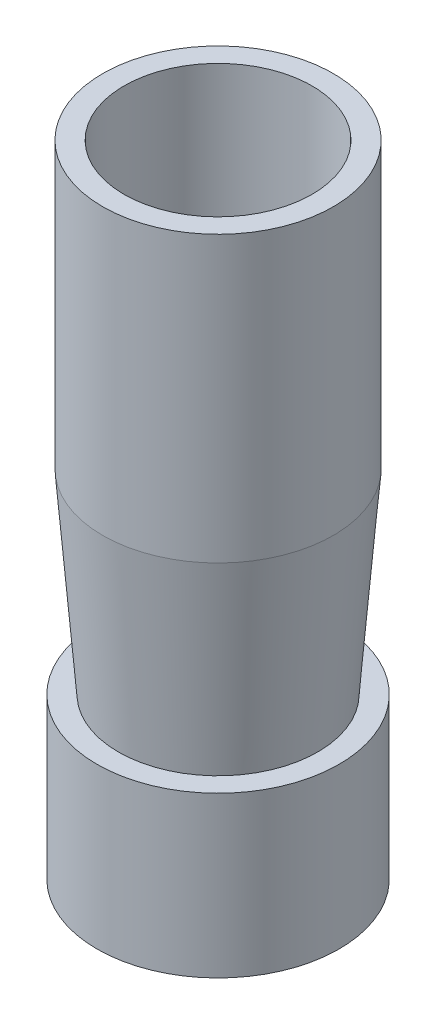
ISO-10303-21;
HEADER;
FILE_DESCRIPTION(('STEP AP214'),'2;1');
FILE_NAME('part.step','',(''),(''),'','','');
FILE_SCHEMA(('AUTOMOTIVE_DESIGN { 1 0 10303 214 1 1 1 1 }'));
ENDSEC;
DATA;
#1=APPLICATION_CONTEXT('core data for automotive mechanical design processes');
#2=APPLICATION_PROTOCOL_DEFINITION('international standard','automotive_design',2000,#1);
#3=PRODUCT_CONTEXT('',#1,'mechanical');
#4=PRODUCT('Part','Part','',(#3));
#5=PRODUCT_RELATED_PRODUCT_CATEGORY('part','',(#4));
#6=PRODUCT_DEFINITION_FORMATION('','',#4);
#7=PRODUCT_DEFINITION_CONTEXT('part definition',#1,'design');
#8=PRODUCT_DEFINITION('design','',#6,#7);
#9=PRODUCT_DEFINITION_SHAPE('','',#8);
#10=(LENGTH_UNIT() NAMED_UNIT(*) SI_UNIT(.MILLI.,.METRE.));
#11=(NAMED_UNIT(*) PLANE_ANGLE_UNIT() SI_UNIT($,.RADIAN.));
#12=(NAMED_UNIT(*) SI_UNIT($,.STERADIAN.) SOLID_ANGLE_UNIT());
#13=UNCERTAINTY_MEASURE_WITH_UNIT(LENGTH_MEASURE(1.E-05),#10,'distance_accuracy_value','');
#14=(GEOMETRIC_REPRESENTATION_CONTEXT(3) GLOBAL_UNCERTAINTY_ASSIGNED_CONTEXT((#13)) GLOBAL_UNIT_ASSIGNED_CONTEXT((#10,
#11,#12)) REPRESENTATION_CONTEXT('',''));
#15=CARTESIAN_POINT('',(0.,0.,0.));
#16=DIRECTION('',(0.,0.,1.));
#17=DIRECTION('',(1.,0.,0.));
#18=AXIS2_PLACEMENT_3D('',#15,#16,#17);
#19=CARTESIAN_POINT('',(-25.6120969503537,43.0163177549968,0.));
#20=DIRECTION('',(0.,1.,0.));
#21=DIRECTION('',(0.,0.,1.));
#22=AXIS2_PLACEMENT_3D('',#19,#20,#21);
#23=PLANE('',#22);
#24=CARTESIAN_POINT('',(-14.7970969503537,43.0163177549968,0.));
#25=DIRECTION('',(0.,1.,0.));
#26=DIRECTION('',(0.,0.,1.));
#27=AXIS2_PLACEMENT_3D('',#24,#25,#26);
#28=CIRCLE('',#27,10.815);
#29=CARTESIAN_POINT('',(-14.7970969503537,43.0163177549968,10.815));
#30=VERTEX_POINT('',#29);
#31=EDGE_CURVE('E10',#30,#30,#28,.T.);
#32=ORIENTED_EDGE('',*,*,#31,.T.);
#33=EDGE_LOOP('',(#32));
#34=FACE_BOUND('',#33,.T.);
#35=CARTESIAN_POINT('',(-14.7970969503537,43.0163177549968,0.));
#36=DIRECTION('',(0.,1.,0.));
#37=DIRECTION('',(0.,0.,1.));
#38=AXIS2_PLACEMENT_3D('',#35,#36,#37);
#39=CIRCLE('',#38,8.81499999999994);
#40=CARTESIAN_POINT('',(-14.7970969503537,43.0163177549968,8.81499999999994));
#41=VERTEX_POINT('',#40);
#42=EDGE_CURVE('E50',#41,#41,#39,.T.);
#43=ORIENTED_EDGE('',*,*,#42,.F.);
#44=EDGE_LOOP('',(#43));
#45=FACE_BOUND('',#44,.T.);
#46=ADVANCED_FACE('F43',(#34,#45),#23,.T.);
#47=CARTESIAN_POINT('',(-14.7970969503537,26.4248387096774,0.));
#48=DIRECTION('',(0.,1.,0.));
#49=DIRECTION('',(0.,0.,1.));
#50=AXIS2_PLACEMENT_3D('',#47,#48,#49);
#51=CYLINDRICAL_SURFACE('',#50,8.81499999999997);
#52=ORIENTED_EDGE('',*,*,#42,.T.);
#53=EDGE_LOOP('',(#52));
#54=FACE_BOUND('',#53,.T.);
#55=CARTESIAN_POINT('',(-14.7970969503537,26.3263177549968,0.));
#56=DIRECTION('',(0.,1.,0.));
#57=DIRECTION('',(0.,0.,1.));
#58=AXIS2_PLACEMENT_3D('',#55,#56,#57);
#59=CIRCLE('',#58,8.815);
#60=CARTESIAN_POINT('',(-14.7970969503537,26.3263177549968,8.815));
#61=VERTEX_POINT('',#60);
#62=EDGE_CURVE('E55',#61,#61,#59,.T.);
#63=ORIENTED_EDGE('',*,*,#62,.F.);
#64=EDGE_LOOP('',(#63));
#65=FACE_BOUND('',#64,.T.);
#66=ADVANCED_FACE('F120',(#54,#65),#51,.F.);
#67=CARTESIAN_POINT('',(-14.7970969503537,-12.3512431395056,0.));
#68=DIRECTION('',(0.,1.,0.));
#69=DIRECTION('',(0.,0.,1.));
#70=AXIS2_PLACEMENT_3D('',#67,#68,#69);
#71=CONICAL_SURFACE('',#70,2.74999999999999,0.155542634404642);
#72=CARTESIAN_POINT('',(-14.7970969503537,-12.3512431395056,0.));
#73=DIRECTION('',(0.,1.,0.));
#74=DIRECTION('',(0.,0.,1.));
#75=AXIS2_PLACEMENT_3D('',#72,#73,#74);
#76=CIRCLE('',#75,2.74999999999999);
#77=CARTESIAN_POINT('',(-14.7970969503537,-12.3512431395056,2.74999999999999));
#78=VERTEX_POINT('',#77);
#79=EDGE_CURVE('E60',#78,#78,#76,.T.);
#80=CARTESIAN_POINT('',(-14.7970969503537,26.3263177549968,8.815));
#81=CARTESIAN_POINT('',(-14.7970969503537,25.923426495679,8.75182291666667));
#82=CARTESIAN_POINT('',(-14.7970969503537,25.5205352363613,8.68864583333333));
#83=CARTESIAN_POINT('',(-14.7970969503537,24.7147527177258,8.56229166666667));
#84=CARTESIAN_POINT('',(-14.7970969503537,24.3118614584081,8.49911458333333));
#85=CARTESIAN_POINT('',(-14.7970969503537,23.5060789397726,8.37276041666667));
#86=CARTESIAN_POINT('',(-14.7970969503537,23.1031876804549,8.30958333333333));
#87=CARTESIAN_POINT('',(-14.7970969503537,22.2974051618194,8.18322916666667));
#88=CARTESIAN_POINT('',(-14.7970969503537,21.8945139025017,8.12005208333333));
#89=CARTESIAN_POINT('',(-14.7970969503537,21.0887313838662,7.99369791666666));
#90=CARTESIAN_POINT('',(-14.7970969503537,20.6858401245485,7.93052083333333));
#91=CARTESIAN_POINT('',(-14.7970969503537,19.880057605913,7.80416666666666));
#92=CARTESIAN_POINT('',(-14.7970969503537,19.4771663465953,7.74098958333333));
#93=CARTESIAN_POINT('',(-14.7970969503537,18.6713838279598,7.61463541666666));
#94=CARTESIAN_POINT('',(-14.7970969503537,18.2684925686421,7.55145833333333));
#95=CARTESIAN_POINT('',(-14.7970969503537,17.4627100500066,7.42510416666666));
#96=CARTESIAN_POINT('',(-14.7970969503537,17.0598187906889,7.36192708333333));
#97=CARTESIAN_POINT('',(-14.7970969503537,16.2540362720534,7.23557291666666));
#98=CARTESIAN_POINT('',(-14.7970969503537,15.8511450127357,7.17239583333333));
#99=CARTESIAN_POINT('',(-14.7970969503537,15.0453624941002,7.04604166666666));
#100=CARTESIAN_POINT('',(-14.7970969503537,14.6424712347825,6.98286458333333));
#101=CARTESIAN_POINT('',(-14.7970969503537,13.836688716147,6.85651041666666));
#102=CARTESIAN_POINT('',(-14.7970969503537,13.4337974568293,6.79333333333333));
#103=CARTESIAN_POINT('',(-14.7970969503537,12.6280149381938,6.66697916666666));
#104=CARTESIAN_POINT('',(-14.7970969503537,12.2251236788761,6.60380208333333));
#105=CARTESIAN_POINT('',(-14.7970969503537,11.4193411602406,6.47744791666666));
#106=CARTESIAN_POINT('',(-14.7970969503537,11.0164499009229,6.41427083333333));
#107=CARTESIAN_POINT('',(-14.7970969503537,10.2106673822874,6.28791666666666));
#108=CARTESIAN_POINT('',(-14.7970969503537,9.8077761229697,6.22473958333333));
#109=CARTESIAN_POINT('',(-14.7970969503537,9.00199360433423,6.09838541666666));
#110=CARTESIAN_POINT('',(-14.7970969503537,8.5991023450165,6.03520833333333));
#111=CARTESIAN_POINT('',(-14.7970969503537,7.79331982638104,5.90885416666666));
#112=CARTESIAN_POINT('',(-14.7970969503537,7.3904285670633,5.84567708333333));
#113=CARTESIAN_POINT('',(-14.7970969503537,6.58464604842783,5.71932291666666));
#114=CARTESIAN_POINT('',(-14.7970969503537,6.1817547891101,5.65614583333333));
#115=CARTESIAN_POINT('',(-14.7970969503537,5.37597227047463,5.52979166666666));
#116=CARTESIAN_POINT('',(-14.7970969503537,4.9730810111569,5.46661458333333));
#117=CARTESIAN_POINT('',(-14.7970969503537,4.16729849252143,5.34026041666666));
#118=CARTESIAN_POINT('',(-14.7970969503537,3.7644072332037,5.27708333333333));
#119=CARTESIAN_POINT('',(-14.7970969503537,2.95862471456823,5.15072916666666));
#120=CARTESIAN_POINT('',(-14.7970969503537,2.5557334552505,5.08755208333333));
#121=CARTESIAN_POINT('',(-14.7970969503537,1.74995093661503,4.96119791666666));
#122=CARTESIAN_POINT('',(-14.7970969503537,1.3470596772973,4.89802083333333));
#123=CARTESIAN_POINT('',(-14.7970969503537,0.54127715866183,4.77166666666666));
#124=CARTESIAN_POINT('',(-14.7970969503537,0.138385899344097,4.70848958333333));
#125=CARTESIAN_POINT('',(-14.7970969503537,-0.667396619291369,4.58213541666666));
#126=CARTESIAN_POINT('',(-14.7970969503537,-1.0702878786091,4.51895833333333));
#127=CARTESIAN_POINT('',(-14.7970969503537,-1.87607039724457,4.39260416666666));
#128=CARTESIAN_POINT('',(-14.7970969503537,-2.2789616565623,4.32942708333333));
#129=CARTESIAN_POINT('',(-14.7970969503537,-3.08474417519777,4.20307291666666));
#130=CARTESIAN_POINT('',(-14.7970969503537,-3.4876354345155,4.13989583333333));
#131=CARTESIAN_POINT('',(-14.7970969503537,-4.29341795315097,4.01354166666666));
#132=CARTESIAN_POINT('',(-14.7970969503537,-4.69630921246871,3.95036458333332));
#133=CARTESIAN_POINT('',(-14.7970969503537,-5.50209173110417,3.82401041666666));
#134=CARTESIAN_POINT('',(-14.7970969503537,-5.9049829904219,3.76083333333332));
#135=CARTESIAN_POINT('',(-14.7970969503537,-6.71076550905737,3.63447916666666));
#136=CARTESIAN_POINT('',(-14.7970969503537,-7.11365676837511,3.57130208333332));
#137=CARTESIAN_POINT('',(-14.7970969503537,-7.91943928701057,3.44494791666666));
#138=CARTESIAN_POINT('',(-14.7970969503537,-8.32233054632831,3.38177083333332));
#139=CARTESIAN_POINT('',(-14.7970969503537,-9.12811306496377,3.25541666666666));
#140=CARTESIAN_POINT('',(-14.7970969503537,-9.53100432428151,3.19223958333332));
#141=CARTESIAN_POINT('',(-14.7970969503537,-10.336786842917,3.06588541666666));
#142=CARTESIAN_POINT('',(-14.7970969503537,-10.7396781022347,3.00270833333332));
#143=CARTESIAN_POINT('',(-14.7970969503537,-11.5454606208702,2.87635416666666));
#144=CARTESIAN_POINT('',(-14.7970969503537,-11.9483518801879,2.81317708333332));
#145=CARTESIAN_POINT('',(-14.7970969503537,-12.3512431395056,2.74999999999999));
#146=B_SPLINE_CURVE_WITH_KNOTS('',3,(#80,#81,#82,#83,#84,#85,#86,#87,#88,#89,#90,#91,#92,#93,
#94,#95,#96,#97,#98,#99,#100,#101,#102,#103,#104,#105,#106,#107,#108,#109,#110,#111,#112,#113,
#114,#115,#116,#117,#118,#119,#120,#121,#122,#123,#124,#125,#126,#127,#128,#129,#130,#131,#132,
#133,#134,#135,#136,#137,#138,#139,#140,#141,#142,#143,#144,#145),.UNSPECIFIED.,.F.,.F.,(4,2,2,
2,2,2,2,2,2,2,2,2,2,2,2,2,2,2,2,2,2,2,2,2,2,2,2,2,2,2,2,2,4),(0.,1.22344366287877,
2.44688732575755,3.67033098863631,4.89377465151509,6.11721831439386,7.34066197727262,
8.5641056401514,9.78754930303017,11.0109929659089,12.2344366287877,13.4578802916665,
14.6813239545453,15.904767617424,17.1282112803028,18.3516549431816,19.5750986060603,
20.7985422689391,22.0219859318179,23.2454295946967,24.4688732575754,25.6923169204542,
26.915760583333,28.1392042462118,29.3626479090905,30.5860915719693,31.8095352348481,
33.0329788977268,34.2564225606056,35.4798662234844,36.7033098863631,37.9267535492419,
39.1501972121207),.UNSPECIFIED.);
#147=EDGE_CURVE('BSEAM124',#61,#78,#146,.T.);
#148=ORIENTED_EDGE('',*,*,#62,.T.);
#149=ORIENTED_EDGE('',*,*,#79,.F.);
#150=ORIENTED_EDGE('',*,*,#147,.T.);
#151=ORIENTED_EDGE('',*,*,#147,.F.);
#152=EDGE_LOOP('',(#148,#150,#149,#151));
#153=FACE_BOUND('',#152,.T.);
#154=ADVANCED_FACE('F124',(#153),#71,.F.);
#155=CARTESIAN_POINT('',(-14.7970969503537,-12.5520427359334,0.));
#156=DIRECTION('',(0.,-1.,0.));
#157=DIRECTION('',(0.,0.,-1.));
#158=AXIS2_PLACEMENT_3D('',#155,#156,#157);
#159=CONICAL_SURFACE('',#158,2.99999999999999,0.894108189836582);
#160=ORIENTED_EDGE('',*,*,#79,.T.);
#161=EDGE_LOOP('',(#160));
#162=FACE_BOUND('',#161,.T.);
#163=CARTESIAN_POINT('',(-14.7970969503537,-12.5520427359334,0.));
#164=DIRECTION('',(0.,1.,0.));
#165=DIRECTION('',(0.,0.,1.));
#166=AXIS2_PLACEMENT_3D('',#163,#164,#165);
#167=CIRCLE('',#166,2.99999999999999);
#168=CARTESIAN_POINT('',(-14.7970969503537,-12.5520427359334,2.99999999999999));
#169=VERTEX_POINT('',#168);
#170=EDGE_CURVE('E66',#169,#169,#167,.T.);
#171=ORIENTED_EDGE('',*,*,#170,.F.);
#172=EDGE_LOOP('',(#171));
#173=FACE_BOUND('',#172,.T.);
#174=ADVANCED_FACE('F129',(#162,#173),#159,.F.);
#175=CARTESIAN_POINT('',(-14.7970969503537,23.1029597459589,0.));
#176=DIRECTION('',(0.,1.,0.));
#177=DIRECTION('',(0.,0.,1.));
#178=AXIS2_PLACEMENT_3D('',#175,#176,#177);
#179=CONICAL_SURFACE('',#178,8.815,0.161667372540477);
#180=ORIENTED_EDGE('',*,*,#170,.T.);
#181=EDGE_LOOP('',(#180));
#182=FACE_BOUND('',#181,.T.);
#183=CARTESIAN_POINT('',(-14.7970969503537,23.1029597459589,0.));
#184=DIRECTION('',(0.,1.,0.));
#185=DIRECTION('',(0.,0.,1.));
#186=AXIS2_PLACEMENT_3D('',#183,#184,#185);
#187=CIRCLE('',#186,8.815);
#188=CARTESIAN_POINT('',(-14.7970969503537,23.1029597459589,8.815));
#189=VERTEX_POINT('',#188);
#190=EDGE_CURVE('E70',#189,#189,#187,.T.);
#191=ORIENTED_EDGE('',*,*,#190,.F.);
#192=EDGE_LOOP('',(#191));
#193=FACE_BOUND('',#192,.T.);
#194=ADVANCED_FACE('F136',(#182,#193),#179,.T.);
#195=CARTESIAN_POINT('',(-14.7970969503537,26.4248387096774,0.));
#196=DIRECTION('',(0.,1.,0.));
#197=DIRECTION('',(0.,0.,1.));
#198=AXIS2_PLACEMENT_3D('',#195,#196,#197);
#199=CYLINDRICAL_SURFACE('',#198,8.815);
#200=ORIENTED_EDGE('',*,*,#190,.T.);
#201=EDGE_LOOP('',(#200));
#202=FACE_BOUND('',#201,.T.);
#203=CARTESIAN_POINT('',(-14.7970969503537,16.3263177549968,0.));
#204=DIRECTION('',(0.,1.,0.));
#205=DIRECTION('',(0.,0.,1.));
#206=AXIS2_PLACEMENT_3D('',#203,#204,#205);
#207=CIRCLE('',#206,8.815);
#208=CARTESIAN_POINT('',(-14.7970969503537,16.3263177549968,8.815));
#209=VERTEX_POINT('',#208);
#210=EDGE_CURVE('E74',#209,#209,#207,.T.);
#211=ORIENTED_EDGE('',*,*,#210,.F.);
#212=EDGE_LOOP('',(#211));
#213=FACE_BOUND('',#212,.T.);
#214=ADVANCED_FACE('F140',(#202,#213),#199,.F.);
#215=CARTESIAN_POINT('',(-14.7970969503537,-7.13260368102019,0.));
#216=DIRECTION('',(0.,1.,0.));
#217=DIRECTION('',(0.,0.,1.));
#218=AXIS2_PLACEMENT_3D('',#215,#216,#217);
#219=CONICAL_SURFACE('',#218,6.94160278866409,0.0796895082429436);
#220=ORIENTED_EDGE('',*,*,#210,.T.);
#221=EDGE_LOOP('',(#220));
#222=FACE_BOUND('',#221,.T.);
#223=CARTESIAN_POINT('',(-14.7970969503537,-7.13260368102019,0.));
#224=DIRECTION('',(0.,1.,0.));
#225=DIRECTION('',(0.,0.,1.));
#226=AXIS2_PLACEMENT_3D('',#223,#224,#225);
#227=CIRCLE('',#226,6.94160278866409);
#228=CARTESIAN_POINT('',(-14.7970969503537,-7.13260368102019,6.94160278866409));
#229=VERTEX_POINT('',#228);
#230=EDGE_CURVE('E78',#229,#229,#227,.T.);
#231=ORIENTED_EDGE('',*,*,#230,.F.);
#232=EDGE_LOOP('',(#231));
#233=FACE_BOUND('',#232,.T.);
#234=ADVANCED_FACE('F144',(#222,#233),#219,.F.);
#235=CARTESIAN_POINT('',(-14.7970969503537,26.4248387096774,0.));
#236=DIRECTION('',(0.,1.,0.));
#237=DIRECTION('',(0.,0.,1.));
#238=AXIS2_PLACEMENT_3D('',#235,#236,#237);
#239=CYLINDRICAL_SURFACE('',#238,6.94160278866409);
#240=ORIENTED_EDGE('',*,*,#230,.T.);
#241=EDGE_LOOP('',(#240));
#242=FACE_BOUND('',#241,.T.);
#243=CARTESIAN_POINT('',(-14.7970969503537,-16.9873258973576,0.));
#244=DIRECTION('',(0.,1.,0.));
#245=DIRECTION('',(0.,0.,1.));
#246=AXIS2_PLACEMENT_3D('',#243,#244,#245);
#247=CIRCLE('',#246,6.94160278866409);
#248=CARTESIAN_POINT('',(-14.7970969503537,-16.9873258973576,6.94160278866409));
#249=VERTEX_POINT('',#248);
#250=EDGE_CURVE('E82',#249,#249,#247,.T.);
#251=ORIENTED_EDGE('',*,*,#250,.F.);
#252=EDGE_LOOP('',(#251));
#253=FACE_BOUND('',#252,.T.);
#254=ADVANCED_FACE('F148',(#242,#253),#239,.F.);
#255=CARTESIAN_POINT('',(-26.1495949232434,-16.9873258973576,0.));
#256=DIRECTION('',(0.,-1.,0.));
#257=DIRECTION('',(0.,0.,-1.));
#258=AXIS2_PLACEMENT_3D('',#255,#256,#257);
#259=PLANE('',#258);
#260=ORIENTED_EDGE('',*,*,#250,.T.);
#261=EDGE_LOOP('',(#260));
#262=FACE_BOUND('',#261,.T.);
#263=CARTESIAN_POINT('',(-14.7970969503537,-16.9873258973576,0.));
#264=DIRECTION('',(0.,1.,0.));
#265=DIRECTION('',(0.,0.,1.));
#266=AXIS2_PLACEMENT_3D('',#263,#264,#265);
#267=CIRCLE('',#266,11.3524979728896);
#268=CARTESIAN_POINT('',(-14.7970969503537,-16.9873258973576,11.3524979728896));
#269=VERTEX_POINT('',#268);
#270=EDGE_CURVE('E86',#269,#269,#267,.T.);
#271=ORIENTED_EDGE('',*,*,#270,.F.);
#272=EDGE_LOOP('',(#271));
#273=FACE_BOUND('',#272,.T.);
#274=ADVANCED_FACE('F152',(#262,#273),#259,.T.);
#275=CARTESIAN_POINT('',(-14.7970969503537,26.4248387096774,0.));
#276=DIRECTION('',(0.,1.,0.));
#277=DIRECTION('',(0.,0.,1.));
#278=AXIS2_PLACEMENT_3D('',#275,#276,#277);
#279=CYLINDRICAL_SURFACE('',#278,11.3524979728896);
#280=ORIENTED_EDGE('',*,*,#270,.T.);
#281=EDGE_LOOP('',(#280));
#282=FACE_BOUND('',#281,.T.);
#283=CARTESIAN_POINT('',(-14.7970969503537,-1.98732120336022,0.));
#284=DIRECTION('',(0.,1.,0.));
#285=DIRECTION('',(0.,0.,1.));
#286=AXIS2_PLACEMENT_3D('',#283,#284,#285);
#287=CIRCLE('',#286,11.3524979728896);
#288=CARTESIAN_POINT('',(-14.7970969503537,-1.98732120336022,11.3524979728896));
#289=VERTEX_POINT('',#288);
#290=EDGE_CURVE('E90',#289,#289,#287,.T.);
#291=ORIENTED_EDGE('',*,*,#290,.F.);
#292=EDGE_LOOP('',(#291));
#293=FACE_BOUND('',#292,.T.);
#294=ADVANCED_FACE('F116',(#282,#293),#279,.T.);
#295=CARTESIAN_POINT('',(-24.1495949232433,-1.98732120336023,0.));
#296=DIRECTION('',(0.,1.,0.));
#297=DIRECTION('',(0.,0.,1.));
#298=AXIS2_PLACEMENT_3D('',#295,#296,#297);
#299=PLANE('',#298);
#300=ORIENTED_EDGE('',*,*,#290,.T.);
#301=EDGE_LOOP('',(#300));
#302=FACE_BOUND('',#301,.T.);
#303=CARTESIAN_POINT('',(-14.7970969503537,-1.98732120336022,0.));
#304=DIRECTION('',(0.,1.,0.));
#305=DIRECTION('',(0.,0.,1.));
#306=AXIS2_PLACEMENT_3D('',#303,#304,#305);
#307=CIRCLE('',#306,9.35249797288959);
#308=CARTESIAN_POINT('',(-14.7970969503537,-1.98732120336022,9.35249797288959));
#309=VERTEX_POINT('',#308);
#310=EDGE_CURVE('E94',#309,#309,#307,.T.);
#311=ORIENTED_EDGE('',*,*,#310,.F.);
#312=EDGE_LOOP('',(#311));
#313=FACE_BOUND('',#312,.T.);
#314=ADVANCED_FACE('F108',(#302,#313),#299,.T.);
#315=CARTESIAN_POINT('',(-14.7970969503537,16.3263177549968,0.));
#316=DIRECTION('',(0.,1.,0.));
#317=DIRECTION('',(0.,0.,1.));
#318=AXIS2_PLACEMENT_3D('',#315,#316,#317);
#319=CONICAL_SURFACE('',#318,10.815,0.0796895082429434);
#320=ORIENTED_EDGE('',*,*,#310,.T.);
#321=EDGE_LOOP('',(#320));
#322=FACE_BOUND('',#321,.T.);
#323=CARTESIAN_POINT('',(-14.7970969503537,16.3263177549968,0.));
#324=DIRECTION('',(0.,1.,0.));
#325=DIRECTION('',(0.,0.,1.));
#326=AXIS2_PLACEMENT_3D('',#323,#324,#325);
#327=CIRCLE('',#326,10.815);
#328=CARTESIAN_POINT('',(-14.7970969503537,16.3263177549968,10.815));
#329=VERTEX_POINT('',#328);
#330=EDGE_CURVE('E98',#329,#329,#327,.T.);
#331=ORIENTED_EDGE('',*,*,#330,.F.);
#332=EDGE_LOOP('',(#331));
#333=FACE_BOUND('',#332,.T.);
#334=ADVANCED_FACE('F106',(#322,#333),#319,.T.);
#335=CARTESIAN_POINT('',(-14.7970969503537,26.4248387096774,0.));
#336=DIRECTION('',(0.,1.,0.));
#337=DIRECTION('',(0.,0.,1.));
#338=AXIS2_PLACEMENT_3D('',#335,#336,#337);
#339=CYLINDRICAL_SURFACE('',#338,10.815);
#340=ORIENTED_EDGE('',*,*,#330,.T.);
#341=EDGE_LOOP('',(#340));
#342=FACE_BOUND('',#341,.T.);
#343=ORIENTED_EDGE('',*,*,#31,.F.);
#344=EDGE_LOOP('',(#343));
#345=FACE_BOUND('',#344,.T.);
#346=ADVANCED_FACE('F103',(#342,#345),#339,.T.);
#347=CLOSED_SHELL('',(#46,#66,#154,#174,#194,#214,#234,#254,#274,#294,#314,#334,#346));
#348=MANIFOLD_SOLID_BREP('B2',#347);
#349=ADVANCED_BREP_SHAPE_REPRESENTATION('',(#18,#348),#14);
#350=SHAPE_DEFINITION_REPRESENTATION(#9,#349);
ENDSEC;
END-ISO-10303-21;
